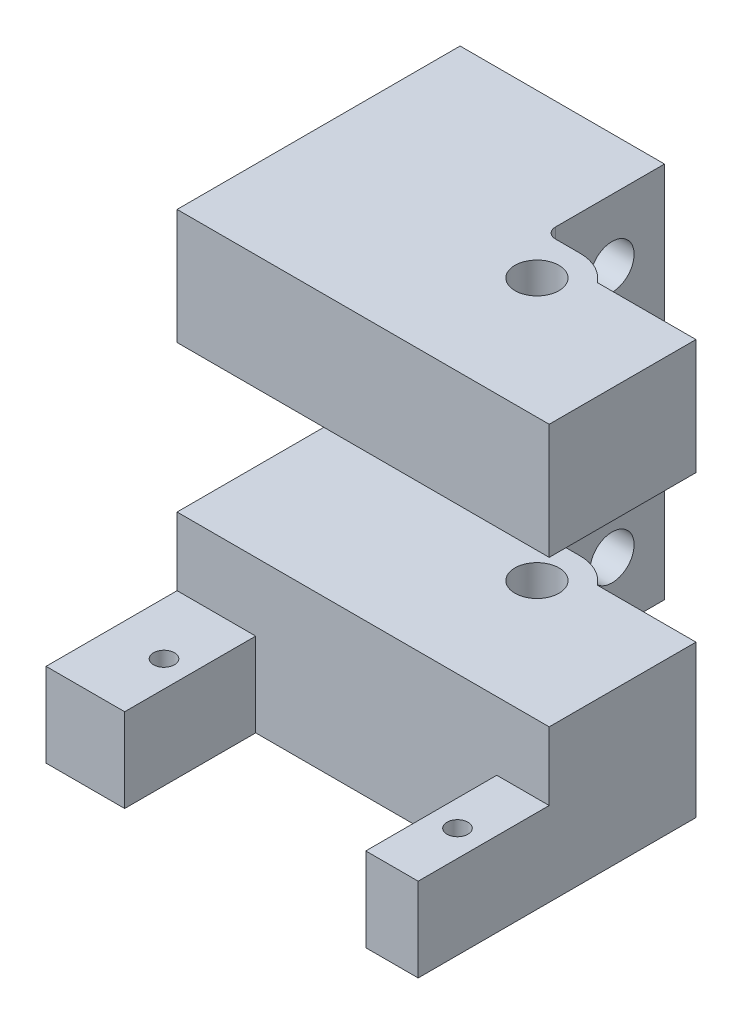
ISO-10303-21;
HEADER;
FILE_DESCRIPTION(('STEP AP214'),'2;1');
FILE_NAME('part.step','',(''),(''),'','','');
FILE_SCHEMA(('AUTOMOTIVE_DESIGN { 1 0 10303 214 1 1 1 1 }'));
ENDSEC;
DATA;
#1=APPLICATION_CONTEXT('core data for automotive mechanical design processes');
#2=APPLICATION_PROTOCOL_DEFINITION('international standard','automotive_design',2000,#1);
#3=PRODUCT_CONTEXT('',#1,'mechanical');
#4=PRODUCT('Part','Part','',(#3));
#5=PRODUCT_RELATED_PRODUCT_CATEGORY('part','',(#4));
#6=PRODUCT_DEFINITION_FORMATION('','',#4);
#7=PRODUCT_DEFINITION_CONTEXT('part definition',#1,'design');
#8=PRODUCT_DEFINITION('design','',#6,#7);
#9=PRODUCT_DEFINITION_SHAPE('','',#8);
#10=(LENGTH_UNIT() NAMED_UNIT(*) SI_UNIT(.MILLI.,.METRE.));
#11=(NAMED_UNIT(*) PLANE_ANGLE_UNIT() SI_UNIT($,.RADIAN.));
#12=(NAMED_UNIT(*) SI_UNIT($,.STERADIAN.) SOLID_ANGLE_UNIT());
#13=UNCERTAINTY_MEASURE_WITH_UNIT(LENGTH_MEASURE(1.E-05),#10,'distance_accuracy_value','');
#14=(GEOMETRIC_REPRESENTATION_CONTEXT(3) GLOBAL_UNCERTAINTY_ASSIGNED_CONTEXT((#13)) GLOBAL_UNIT_ASSIGNED_CONTEXT((#10,
#11,#12)) REPRESENTATION_CONTEXT('',''));
#15=CARTESIAN_POINT('',(0.,0.,0.));
#16=DIRECTION('',(0.,0.,1.));
#17=DIRECTION('',(1.,0.,0.));
#18=AXIS2_PLACEMENT_3D('',#15,#16,#17);
#19=CARTESIAN_POINT('',(-64.4473319220206,11.5,-25.25));
#20=DIRECTION('',(0.,0.,-1.));
#21=DIRECTION('',(0.,1.,0.));
#22=AXIS2_PLACEMENT_3D('',#19,#20,#21);
#23=PLANE('',#22);
#24=DIRECTION('',(-1.,0.,0.));
#25=VECTOR('',#24,1.);
#26=CARTESIAN_POINT('',(16.5,8.,-25.25));
#27=LINE('',#26,#25);
#28=CARTESIAN_POINT('',(16.5,8.,-25.25));
#29=VERTEX_POINT('',#28);
#30=CARTESIAN_POINT('',(7.08187991276449,8.,-25.25));
#31=VERTEX_POINT('',#30);
#32=EDGE_CURVE('E385',#29,#31,#27,.T.);
#33=ORIENTED_EDGE('',*,*,#32,.T.);
#34=DIRECTION('',(0.,-1.,0.));
#35=VECTOR('',#34,1.);
#36=CARTESIAN_POINT('',(7.08187991276449,36.2735620751605,-25.25));
#37=LINE('',#36,#35);
#38=CARTESIAN_POINT('',(7.08187991276449,22.5,-25.25));
#39=VERTEX_POINT('',#38);
#40=EDGE_CURVE('E278',#39,#31,#37,.T.);
#41=ORIENTED_EDGE('',*,*,#40,.F.);
#42=DIRECTION('',(1.,0.,0.));
#43=VECTOR('',#42,1.);
#44=CARTESIAN_POINT('',(0.500000000000009,22.5,-25.25));
#45=LINE('',#44,#43);
#46=CARTESIAN_POINT('',(16.5,22.5,-25.25));
#47=VERTEX_POINT('',#46);
#48=EDGE_CURVE('E375',#39,#47,#45,.T.);
#49=ORIENTED_EDGE('',*,*,#48,.T.);
#50=DIRECTION('',(0.,-1.,0.));
#51=VECTOR('',#50,1.);
#52=CARTESIAN_POINT('',(16.5,22.5,-25.25));
#53=LINE('',#52,#51);
#54=EDGE_CURVE('E389',#47,#29,#53,.T.);
#55=ORIENTED_EDGE('',*,*,#54,.T.);
#56=EDGE_LOOP('',(#33,#41,#49,#55));
#57=FACE_BOUND('',#56,.T.);
#58=ADVANCED_FACE('F52',(#57),#23,.T.);
#59=CARTESIAN_POINT('',(0.500000000000008,0.,0.));
#60=DIRECTION('',(1.,0.,0.));
#61=DIRECTION('',(0.,0.,-1.));
#62=AXIS2_PLACEMENT_3D('',#59,#60,#61);
#63=PLANE('',#62);
#64=CARTESIAN_POINT('',(0.500000000000001,41.5,-33.25));
#65=DIRECTION('',(1.,0.,0.));
#66=DIRECTION('',(0.,0.,-1.));
#67=AXIS2_PLACEMENT_3D('',#64,#65,#66);
#68=CIRCLE('',#67,2.1);
#69=CARTESIAN_POINT('',(0.5,41.5,-35.35));
#70=VERTEX_POINT('',#69);
#71=EDGE_CURVE('E617',#70,#70,#68,.T.);
#72=ORIENTED_EDGE('',*,*,#71,.F.);
#73=EDGE_LOOP('',(#72));
#74=FACE_BOUND('',#73,.T.);
#75=CARTESIAN_POINT('',(0.500000000000001,17.5,-33.25));
#76=DIRECTION('',(1.,0.,0.));
#77=DIRECTION('',(0.,0.,-1.));
#78=AXIS2_PLACEMENT_3D('',#75,#76,#77);
#79=CIRCLE('',#78,2.1);
#80=CARTESIAN_POINT('',(0.5,17.5,-35.35));
#81=VERTEX_POINT('',#80);
#82=EDGE_CURVE('E611',#81,#81,#79,.T.);
#83=ORIENTED_EDGE('',*,*,#82,.F.);
#84=EDGE_LOOP('',(#83));
#85=FACE_BOUND('',#84,.T.);
#86=CARTESIAN_POINT('',(0.500000000000001,29.5,-33.25));
#87=DIRECTION('',(1.,0.,0.));
#88=DIRECTION('',(0.,0.,-1.));
#89=AXIS2_PLACEMENT_3D('',#86,#87,#88);
#90=CIRCLE('',#89,2.1);
#91=CARTESIAN_POINT('',(0.5,29.5,-35.35));
#92=VERTEX_POINT('',#91);
#93=EDGE_CURVE('E605',#92,#92,#90,.T.);
#94=ORIENTED_EDGE('',*,*,#93,.F.);
#95=EDGE_LOOP('',(#94));
#96=FACE_BOUND('',#95,.T.);
#97=DIRECTION('',(0.,0.,-1.));
#98=VECTOR('',#97,1.);
#99=CARTESIAN_POINT('',(0.5,22.5,-29.25));
#100=LINE('',#99,#98);
#101=CARTESIAN_POINT('',(0.5,22.5,-27.85));
#102=VERTEX_POINT('',#101);
#103=CARTESIAN_POINT('',(0.500000000000002,22.5,-29.9828873076406));
#104=VERTEX_POINT('',#103);
#105=EDGE_CURVE('E294',#102,#104,#100,.T.);
#106=ORIENTED_EDGE('',*,*,#105,.F.);
#107=DIRECTION('',(0.,-1.,0.));
#108=VECTOR('',#107,1.);
#109=CARTESIAN_POINT('',(0.500000000000002,11.5,-27.85));
#110=LINE('',#109,#108);
#111=CARTESIAN_POINT('',(0.500000000000002,11.5,-27.85));
#112=VERTEX_POINT('',#111);
#113=EDGE_CURVE('E451',#102,#112,#110,.T.);
#114=ORIENTED_EDGE('',*,*,#113,.T.);
#115=DIRECTION('',(0.,0.,-1.));
#116=VECTOR('',#115,1.);
#117=CARTESIAN_POINT('',(0.500000000000002,11.5,-26.25));
#118=LINE('',#117,#116);
#119=CARTESIAN_POINT('',(0.5,11.5,-38.25));
#120=VERTEX_POINT('',#119);
#121=EDGE_CURVE('E422',#112,#120,#118,.T.);
#122=ORIENTED_EDGE('',*,*,#121,.T.);
#123=DIRECTION('',(0.,1.,0.));
#124=VECTOR('',#123,1.);
#125=CARTESIAN_POINT('',(0.5,11.5,-38.25));
#126=LINE('',#125,#124);
#127=CARTESIAN_POINT('',(0.5,47.5,-38.25));
#128=VERTEX_POINT('',#127);
#129=EDGE_CURVE('E425',#120,#128,#126,.T.);
#130=ORIENTED_EDGE('',*,*,#129,.T.);
#131=DIRECTION('',(0.,0.,1.));
#132=VECTOR('',#131,1.);
#133=CARTESIAN_POINT('',(0.5,47.5,-38.25));
#134=LINE('',#133,#132);
#135=CARTESIAN_POINT('',(0.500000000000002,47.5,-27.85));
#136=VERTEX_POINT('',#135);
#137=EDGE_CURVE('E428',#128,#136,#134,.T.);
#138=ORIENTED_EDGE('',*,*,#137,.T.);
#139=DIRECTION('',(0.,1.,0.));
#140=VECTOR('',#139,1.);
#141=CARTESIAN_POINT('',(0.500000000000002,0.,-27.85));
#142=LINE('',#141,#140);
#143=CARTESIAN_POINT('',(0.5,36.5,-27.85));
#144=VERTEX_POINT('',#143);
#145=EDGE_CURVE('E446',#136,#144,#142,.F.);
#146=ORIENTED_EDGE('',*,*,#145,.T.);
#147=DIRECTION('',(0.,0.,1.));
#148=VECTOR('',#147,1.);
#149=CARTESIAN_POINT('',(0.5,36.5,-29.25));
#150=LINE('',#149,#148);
#151=CARTESIAN_POINT('',(0.5,36.5,-29.9828873076406));
#152=VERTEX_POINT('',#151);
#153=EDGE_CURVE('E286',#152,#144,#150,.T.);
#154=ORIENTED_EDGE('',*,*,#153,.F.);
#155=DIRECTION('',(0.,-1.,0.));
#156=VECTOR('',#155,1.);
#157=CARTESIAN_POINT('',(0.500000000000002,0.,-29.9828873076406));
#158=LINE('',#157,#156);
#159=EDGE_CURVE('E448',#152,#104,#158,.T.);
#160=ORIENTED_EDGE('',*,*,#159,.T.);
#161=EDGE_LOOP('',(#106,#114,#122,#130,#138,#146,#154,#160));
#162=FACE_BOUND('',#161,.T.);
#163=ADVANCED_FACE('F479',(#74,#85,#96,#162),#63,.T.);
#164=CARTESIAN_POINT('',(-64.4473319220206,11.5,-25.25));
#165=DIRECTION('',(0.,0.,-1.));
#166=DIRECTION('',(0.,1.,0.));
#167=AXIS2_PLACEMENT_3D('',#164,#165,#166);
#168=PLANE('',#167);
#169=DIRECTION('',(-1.,0.,0.));
#170=VECTOR('',#169,1.);
#171=CARTESIAN_POINT('',(16.5,36.5,-25.25));
#172=LINE('',#171,#170);
#173=CARTESIAN_POINT('',(16.5,36.5,-25.25));
#174=VERTEX_POINT('',#173);
#175=CARTESIAN_POINT('',(7.08187991276449,36.5,-25.25));
#176=VERTEX_POINT('',#175);
#177=EDGE_CURVE('E373',#174,#176,#172,.T.);
#178=ORIENTED_EDGE('',*,*,#177,.T.);
#179=DIRECTION('',(0.,1.,0.));
#180=VECTOR('',#179,1.);
#181=CARTESIAN_POINT('',(7.08187991276449,22.7264379248395,-25.25));
#182=LINE('',#181,#180);
#183=CARTESIAN_POINT('',(7.08187991276449,47.5,-25.25));
#184=VERTEX_POINT('',#183);
#185=EDGE_CURVE('E248',#176,#184,#182,.T.);
#186=ORIENTED_EDGE('',*,*,#185,.T.);
#187=DIRECTION('',(1.,0.,0.));
#188=VECTOR('',#187,1.);
#189=CARTESIAN_POINT('',(0.500000000000013,47.5,-25.25));
#190=LINE('',#189,#188);
#191=CARTESIAN_POINT('',(16.5,47.5,-25.25));
#192=VERTEX_POINT('',#191);
#193=EDGE_CURVE('E262',#184,#192,#190,.T.);
#194=ORIENTED_EDGE('',*,*,#193,.T.);
#195=DIRECTION('',(0.,-1.,0.));
#196=VECTOR('',#195,1.);
#197=CARTESIAN_POINT('',(16.5,47.5,-25.25));
#198=LINE('',#197,#196);
#199=EDGE_CURVE('E376',#192,#174,#198,.T.);
#200=ORIENTED_EDGE('',*,*,#199,.T.);
#201=EDGE_LOOP('',(#178,#186,#194,#200));
#202=FACE_BOUND('',#201,.T.);
#203=ADVANCED_FACE('F505',(#202),#168,.T.);
#204=CARTESIAN_POINT('',(-19.,16.,6.25));
#205=DIRECTION('',(-1.,0.,0.));
#206=DIRECTION('',(0.,0.,1.));
#207=AXIS2_PLACEMENT_3D('',#204,#205,#206);
#208=PLANE('',#207);
#209=DIRECTION('',(0.,0.,1.));
#210=VECTOR('',#209,1.);
#211=CARTESIAN_POINT('',(-19.,22.5,-6.25));
#212=LINE('',#211,#210);
#213=CARTESIAN_POINT('',(-19.,22.5,-26.25));
#214=VERTEX_POINT('',#213);
#215=CARTESIAN_POINT('',(-19.,22.5,-11.25));
#216=VERTEX_POINT('',#215);
#217=EDGE_CURVE('E406',#214,#216,#212,.T.);
#218=ORIENTED_EDGE('',*,*,#217,.F.);
#219=DIRECTION('',(0.,-1.,0.));
#220=VECTOR('',#219,1.);
#221=CARTESIAN_POINT('',(-19.,57.577238908358,-26.25));
#222=LINE('',#221,#220);
#223=CARTESIAN_POINT('',(-19.,36.5,-26.25));
#224=VERTEX_POINT('',#223);
#225=EDGE_CURVE('E296',#224,#214,#222,.T.);
#226=ORIENTED_EDGE('',*,*,#225,.F.);
#227=DIRECTION('',(0.,0.,-1.));
#228=VECTOR('',#227,1.);
#229=CARTESIAN_POINT('',(-19.,36.5,-21.25));
#230=LINE('',#229,#228);
#231=CARTESIAN_POINT('',(-19.,36.5,-11.25));
#232=VERTEX_POINT('',#231);
#233=EDGE_CURVE('E409',#232,#224,#230,.T.);
#234=ORIENTED_EDGE('',*,*,#233,.F.);
#235=DIRECTION('',(0.,-1.,0.));
#236=VECTOR('',#235,1.);
#237=CARTESIAN_POINT('',(-19.,47.5,-11.25));
#238=LINE('',#237,#236);
#239=CARTESIAN_POINT('',(-19.,47.5,-11.25));
#240=VERTEX_POINT('',#239);
#241=EDGE_CURVE('E357',#240,#232,#238,.T.);
#242=ORIENTED_EDGE('',*,*,#241,.F.);
#243=DIRECTION('',(0.,0.,1.));
#244=VECTOR('',#243,1.);
#245=CARTESIAN_POINT('',(-19.,47.5,6.25));
#246=LINE('',#245,#244);
#247=CARTESIAN_POINT('',(-19.,47.5,-38.25));
#248=VERTEX_POINT('',#247);
#249=EDGE_CURVE('E411',#248,#240,#246,.T.);
#250=ORIENTED_EDGE('',*,*,#249,.F.);
#251=DIRECTION('',(0.,1.,0.));
#252=VECTOR('',#251,1.);
#253=CARTESIAN_POINT('',(-19.,47.5,-38.25));
#254=LINE('',#253,#252);
#255=CARTESIAN_POINT('',(-19.,11.5,-38.25));
#256=VERTEX_POINT('',#255);
#257=EDGE_CURVE('E414',#256,#248,#254,.T.);
#258=ORIENTED_EDGE('',*,*,#257,.F.);
#259=DIRECTION('',(0.,0.,-1.));
#260=VECTOR('',#259,1.);
#261=CARTESIAN_POINT('',(-19.,11.5,-38.25));
#262=LINE('',#261,#260);
#263=CARTESIAN_POINT('',(-19.,11.5,-25.25));
#264=VERTEX_POINT('',#263);
#265=EDGE_CURVE('E417',#264,#256,#262,.T.);
#266=ORIENTED_EDGE('',*,*,#265,.F.);
#267=DIRECTION('',(0.,1.,0.));
#268=VECTOR('',#267,1.);
#269=CARTESIAN_POINT('',(-19.,7.99999999999998,-25.25));
#270=LINE('',#269,#268);
#271=CARTESIAN_POINT('',(-19.,8.,-25.25));
#272=VERTEX_POINT('',#271);
#273=EDGE_CURVE('E383',#272,#264,#270,.T.);
#274=ORIENTED_EDGE('',*,*,#273,.F.);
#275=DIRECTION('',(0.,0.,-1.));
#276=VECTOR('',#275,1.);
#277=CARTESIAN_POINT('',(-19.,8.,6.25));
#278=LINE('',#277,#276);
#279=CARTESIAN_POINT('',(-19.,8.,1.25));
#280=VERTEX_POINT('',#279);
#281=EDGE_CURVE('E382',#280,#272,#278,.T.);
#282=ORIENTED_EDGE('',*,*,#281,.F.);
#283=DIRECTION('',(0.,-1.,0.));
#284=VECTOR('',#283,1.);
#285=CARTESIAN_POINT('',(-19.,16.,1.25));
#286=LINE('',#285,#284);
#287=CARTESIAN_POINT('',(-19.,16.,1.25));
#288=VERTEX_POINT('',#287);
#289=EDGE_CURVE('E307',#288,#280,#286,.T.);
#290=ORIENTED_EDGE('',*,*,#289,.F.);
#291=DIRECTION('',(0.,0.,1.));
#292=VECTOR('',#291,1.);
#293=CARTESIAN_POINT('',(-19.,16.,6.25));
#294=LINE('',#293,#292);
#295=CARTESIAN_POINT('',(-19.,16.,-11.25));
#296=VERTEX_POINT('',#295);
#297=EDGE_CURVE('E403',#296,#288,#294,.T.);
#298=ORIENTED_EDGE('',*,*,#297,.F.);
#299=DIRECTION('',(0.,-1.,0.));
#300=VECTOR('',#299,1.);
#301=CARTESIAN_POINT('',(-19.,22.5,-11.25));
#302=LINE('',#301,#300);
#303=EDGE_CURVE('E349',#216,#296,#302,.T.);
#304=ORIENTED_EDGE('',*,*,#303,.F.);
#305=EDGE_LOOP('',(#218,#226,#234,#242,#250,#258,#266,#274,#282,#290,#298,#304));
#306=FACE_BOUND('',#305,.T.);
#307=ADVANCED_FACE('F490',(#306),#208,.T.);
#308=CARTESIAN_POINT('',(-11.5,16.,6.25));
#309=DIRECTION('',(-1.,0.,0.));
#310=DIRECTION('',(0.,0.,1.));
#311=AXIS2_PLACEMENT_3D('',#308,#309,#310);
#312=PLANE('',#311);
#313=DIRECTION('',(0.,1.,0.));
#314=VECTOR('',#313,1.);
#315=CARTESIAN_POINT('',(-11.5,8.,1.25));
#316=LINE('',#315,#314);
#317=CARTESIAN_POINT('',(-11.5,8.,1.25));
#318=VERTEX_POINT('',#317);
#319=CARTESIAN_POINT('',(-11.5,16.,1.25));
#320=VERTEX_POINT('',#319);
#321=EDGE_CURVE('E329',#318,#320,#316,.T.);
#322=ORIENTED_EDGE('',*,*,#321,.F.);
#323=DIRECTION('',(0.,0.,1.));
#324=VECTOR('',#323,1.);
#325=CARTESIAN_POINT('',(-11.5,8.,-6.25));
#326=LINE('',#325,#324);
#327=CARTESIAN_POINT('',(-11.5,8.,-11.25));
#328=VERTEX_POINT('',#327);
#329=EDGE_CURVE('E400',#328,#318,#326,.T.);
#330=ORIENTED_EDGE('',*,*,#329,.F.);
#331=DIRECTION('',(0.,-1.,0.));
#332=VECTOR('',#331,1.);
#333=CARTESIAN_POINT('',(-11.5,16.,-11.25));
#334=LINE('',#333,#332);
#335=CARTESIAN_POINT('',(-11.5,16.,-11.25));
#336=VERTEX_POINT('',#335);
#337=EDGE_CURVE('E332',#336,#328,#334,.T.);
#338=ORIENTED_EDGE('',*,*,#337,.F.);
#339=DIRECTION('',(0.,0.,-1.));
#340=VECTOR('',#339,1.);
#341=CARTESIAN_POINT('',(-11.5,16.,6.25));
#342=LINE('',#341,#340);
#343=EDGE_CURVE('E439',#320,#336,#342,.T.);
#344=ORIENTED_EDGE('',*,*,#343,.F.);
#345=EDGE_LOOP('',(#322,#330,#338,#344));
#346=FACE_BOUND('',#345,.T.);
#347=ADVANCED_FACE('F512',(#346),#312,.F.);
#348=CARTESIAN_POINT('',(11.5,16.,6.25));
#349=DIRECTION('',(1.,0.,0.));
#350=DIRECTION('',(0.,0.,-1.));
#351=AXIS2_PLACEMENT_3D('',#348,#349,#350);
#352=PLANE('',#351);
#353=DIRECTION('',(0.,-1.,0.));
#354=VECTOR('',#353,1.);
#355=CARTESIAN_POINT('',(11.5,16.,1.25));
#356=LINE('',#355,#354);
#357=CARTESIAN_POINT('',(11.5,16.,1.25));
#358=VERTEX_POINT('',#357);
#359=CARTESIAN_POINT('',(11.5,8.,1.25));
#360=VERTEX_POINT('',#359);
#361=EDGE_CURVE('E316',#358,#360,#356,.T.);
#362=ORIENTED_EDGE('',*,*,#361,.F.);
#363=DIRECTION('',(0.,0.,1.));
#364=VECTOR('',#363,1.);
#365=CARTESIAN_POINT('',(11.5,16.,6.25));
#366=LINE('',#365,#364);
#367=CARTESIAN_POINT('',(11.5,16.,-11.25));
#368=VERTEX_POINT('',#367);
#369=EDGE_CURVE('E441',#368,#358,#366,.T.);
#370=ORIENTED_EDGE('',*,*,#369,.F.);
#371=DIRECTION('',(0.,1.,0.));
#372=VECTOR('',#371,1.);
#373=CARTESIAN_POINT('',(11.5,8.,-11.25));
#374=LINE('',#373,#372);
#375=CARTESIAN_POINT('',(11.5,8.,-11.25));
#376=VERTEX_POINT('',#375);
#377=EDGE_CURVE('E339',#376,#368,#374,.T.);
#378=ORIENTED_EDGE('',*,*,#377,.F.);
#379=DIRECTION('',(0.,0.,-1.));
#380=VECTOR('',#379,1.);
#381=CARTESIAN_POINT('',(11.5,8.,6.25));
#382=LINE('',#381,#380);
#383=EDGE_CURVE('E398',#360,#376,#382,.T.);
#384=ORIENTED_EDGE('',*,*,#383,.F.);
#385=EDGE_LOOP('',(#362,#370,#378,#384));
#386=FACE_BOUND('',#385,.T.);
#387=ADVANCED_FACE('F555',(#386),#352,.F.);
#388=CARTESIAN_POINT('',(16.5,16.,-21.25));
#389=DIRECTION('',(-1.,0.,0.));
#390=DIRECTION('',(0.,0.,1.));
#391=AXIS2_PLACEMENT_3D('',#388,#389,#390);
#392=PLANE('',#391);
#393=DIRECTION('',(0.,1.,0.));
#394=VECTOR('',#393,1.);
#395=CARTESIAN_POINT('',(16.5,8.,1.25));
#396=LINE('',#395,#394);
#397=CARTESIAN_POINT('',(16.5,8.,1.25));
#398=VERTEX_POINT('',#397);
#399=CARTESIAN_POINT('',(16.5,16.,1.25));
#400=VERTEX_POINT('',#399);
#401=EDGE_CURVE('E321',#398,#400,#396,.T.);
#402=ORIENTED_EDGE('',*,*,#401,.F.);
#403=DIRECTION('',(0.,0.,1.));
#404=VECTOR('',#403,1.);
#405=CARTESIAN_POINT('',(16.5,8.,-21.25));
#406=LINE('',#405,#404);
#407=EDGE_CURVE('E395',#29,#398,#406,.T.);
#408=ORIENTED_EDGE('',*,*,#407,.F.);
#409=ORIENTED_EDGE('',*,*,#54,.F.);
#410=DIRECTION('',(0.,0.,-1.));
#411=VECTOR('',#410,1.);
#412=CARTESIAN_POINT('',(16.5,22.5,-6.25));
#413=LINE('',#412,#411);
#414=CARTESIAN_POINT('',(16.5,22.5,-11.25));
#415=VERTEX_POINT('',#414);
#416=EDGE_CURVE('E434',#415,#47,#413,.T.);
#417=ORIENTED_EDGE('',*,*,#416,.F.);
#418=DIRECTION('',(0.,1.,0.));
#419=VECTOR('',#418,1.);
#420=CARTESIAN_POINT('',(16.5,16.,-11.25));
#421=LINE('',#420,#419);
#422=CARTESIAN_POINT('',(16.5,16.,-11.25));
#423=VERTEX_POINT('',#422);
#424=EDGE_CURVE('E345',#423,#415,#421,.T.);
#425=ORIENTED_EDGE('',*,*,#424,.F.);
#426=DIRECTION('',(0.,0.,-1.));
#427=VECTOR('',#426,1.);
#428=CARTESIAN_POINT('',(16.5,16.,-21.25));
#429=LINE('',#428,#427);
#430=EDGE_CURVE('E444',#400,#423,#429,.T.);
#431=ORIENTED_EDGE('',*,*,#430,.F.);
#432=EDGE_LOOP('',(#402,#408,#409,#417,#425,#431));
#433=FACE_BOUND('',#432,.T.);
#434=ADVANCED_FACE('F551',(#433),#392,.F.);
#435=CARTESIAN_POINT('',(0.,16.,0.));
#436=DIRECTION('',(0.,1.,0.));
#437=DIRECTION('',(0.,0.,1.));
#438=AXIS2_PLACEMENT_3D('',#435,#436,#437);
#439=PLANE('',#438);
#440=CARTESIAN_POINT('',(-14.,16.,-5.));
#441=DIRECTION('',(0.,1.,0.));
#442=DIRECTION('',(0.,0.,-1.));
#443=AXIS2_PLACEMENT_3D('',#440,#441,#442);
#444=CIRCLE('',#443,1.);
#445=CARTESIAN_POINT('',(-14.,16.,-6.));
#446=VERTEX_POINT('',#445);
#447=EDGE_CURVE('E289',#446,#446,#444,.T.);
#448=ORIENTED_EDGE('',*,*,#447,.F.);
#449=EDGE_LOOP('',(#448));
#450=FACE_BOUND('',#449,.T.);
#451=ORIENTED_EDGE('',*,*,#297,.T.);
#452=DIRECTION('',(-1.,0.,0.));
#453=VECTOR('',#452,1.);
#454=CARTESIAN_POINT('',(-11.5,16.,1.25));
#455=LINE('',#454,#453);
#456=EDGE_CURVE('E319',#320,#288,#455,.T.);
#457=ORIENTED_EDGE('',*,*,#456,.F.);
#458=ORIENTED_EDGE('',*,*,#343,.T.);
#459=DIRECTION('',(1.,0.,0.));
#460=VECTOR('',#459,1.);
#461=CARTESIAN_POINT('',(-19.,16.,-11.25));
#462=LINE('',#461,#460);
#463=EDGE_CURVE('E352',#296,#336,#462,.T.);
#464=ORIENTED_EDGE('',*,*,#463,.F.);
#465=EDGE_LOOP('',(#451,#457,#458,#464));
#466=FACE_BOUND('',#465,.T.);
#467=ADVANCED_FACE('F547',(#450,#466),#439,.T.);
#468=CARTESIAN_POINT('',(14.,16.,-5.));
#469=DIRECTION('',(0.,1.,0.));
#470=DIRECTION('',(0.,0.,1.));
#471=AXIS2_PLACEMENT_3D('',#468,#469,#470);
#472=CIRCLE('',#471,1.);
#473=CARTESIAN_POINT('',(14.,16.,-4.));
#474=VERTEX_POINT('',#473);
#475=EDGE_CURVE('E308',#474,#474,#472,.T.);
#476=ORIENTED_EDGE('',*,*,#475,.F.);
#477=EDGE_LOOP('',(#476));
#478=FACE_BOUND('',#477,.T.);
#479=ORIENTED_EDGE('',*,*,#369,.T.);
#480=DIRECTION('',(-1.,0.,0.));
#481=VECTOR('',#480,1.);
#482=CARTESIAN_POINT('',(16.5,16.,1.25));
#483=LINE('',#482,#481);
#484=EDGE_CURVE('E323',#400,#358,#483,.T.);
#485=ORIENTED_EDGE('',*,*,#484,.F.);
#486=ORIENTED_EDGE('',*,*,#430,.T.);
#487=DIRECTION('',(1.,0.,0.));
#488=VECTOR('',#487,1.);
#489=CARTESIAN_POINT('',(11.5,16.,-11.25));
#490=LINE('',#489,#488);
#491=EDGE_CURVE('E342',#368,#423,#490,.T.);
#492=ORIENTED_EDGE('',*,*,#491,.F.);
#493=EDGE_LOOP('',(#479,#485,#486,#492));
#494=FACE_BOUND('',#493,.T.);
#495=ADVANCED_FACE('F550',(#478,#494),#439,.T.);
#496=CARTESIAN_POINT('',(0.,8.,0.));
#497=DIRECTION('',(0.,-1.,0.));
#498=DIRECTION('',(0.,0.,-1.));
#499=AXIS2_PLACEMENT_3D('',#496,#497,#498);
#500=PLANE('',#499);
#501=CARTESIAN_POINT('',(0.582649189055734,8.,-25.25));
#502=VERTEX_POINT('',#501);
#503=EDGE_CURVE('E388',#502,#272,#27,.T.);
#504=ORIENTED_EDGE('',*,*,#503,.F.);
#505=CARTESIAN_POINT('',(3.83226455091011,8.,-22.75));
#506=DIRECTION('',(0.,-1.,0.));
#507=DIRECTION('',(0.,0.,-1.));
#508=AXIS2_PLACEMENT_3D('',#505,#506,#507);
#509=CIRCLE('',#508,4.1);
#510=EDGE_CURVE('E598',#502,#31,#509,.T.);
#511=ORIENTED_EDGE('',*,*,#510,.T.);
#512=ORIENTED_EDGE('',*,*,#32,.F.);
#513=ORIENTED_EDGE('',*,*,#407,.T.);
#514=DIRECTION('',(1.,0.,0.));
#515=VECTOR('',#514,1.);
#516=CARTESIAN_POINT('',(11.5,8.,1.25));
#517=LINE('',#516,#515);
#518=EDGE_CURVE('E318',#360,#398,#517,.T.);
#519=ORIENTED_EDGE('',*,*,#518,.F.);
#520=ORIENTED_EDGE('',*,*,#383,.T.);
#521=DIRECTION('',(1.,0.,0.));
#522=VECTOR('',#521,1.);
#523=CARTESIAN_POINT('',(-11.5,8.,-11.25));
#524=LINE('',#523,#522);
#525=EDGE_CURVE('E335',#328,#376,#524,.T.);
#526=ORIENTED_EDGE('',*,*,#525,.F.);
#527=ORIENTED_EDGE('',*,*,#329,.T.);
#528=DIRECTION('',(1.,0.,0.));
#529=VECTOR('',#528,1.);
#530=CARTESIAN_POINT('',(-19.,8.,1.25));
#531=LINE('',#530,#529);
#532=EDGE_CURVE('E327',#280,#318,#531,.T.);
#533=ORIENTED_EDGE('',*,*,#532,.F.);
#534=ORIENTED_EDGE('',*,*,#281,.T.);
#535=EDGE_LOOP('',(#504,#511,#512,#513,#519,#520,#526,#527,#533,#534));
#536=FACE_BOUND('',#535,.T.);
#537=CARTESIAN_POINT('',(14.,8.,-5.));
#538=DIRECTION('',(0.,1.,0.));
#539=DIRECTION('',(0.,0.,1.));
#540=AXIS2_PLACEMENT_3D('',#537,#538,#539);
#541=CIRCLE('',#540,1.);
#542=CARTESIAN_POINT('',(14.,8.,-4.));
#543=VERTEX_POINT('',#542);
#544=EDGE_CURVE('E304',#543,#543,#541,.T.);
#545=ORIENTED_EDGE('',*,*,#544,.T.);
#546=EDGE_LOOP('',(#545));
#547=FACE_BOUND('',#546,.T.);
#548=CARTESIAN_POINT('',(-14.,8.,-5.));
#549=DIRECTION('',(0.,1.,0.));
#550=DIRECTION('',(0.,0.,-1.));
#551=AXIS2_PLACEMENT_3D('',#548,#549,#550);
#552=CIRCLE('',#551,1.);
#553=CARTESIAN_POINT('',(-14.,8.,-6.));
#554=VERTEX_POINT('',#553);
#555=EDGE_CURVE('E311',#554,#554,#552,.T.);
#556=ORIENTED_EDGE('',*,*,#555,.T.);
#557=EDGE_LOOP('',(#556));
#558=FACE_BOUND('',#557,.T.);
#559=CARTESIAN_POINT('',(3.83226455091011,8.,-22.75));
#560=DIRECTION('',(0.,-1.,0.));
#561=DIRECTION('',(0.,0.,-1.));
#562=AXIS2_PLACEMENT_3D('',#559,#560,#561);
#563=CIRCLE('',#562,2.1);
#564=CARTESIAN_POINT('',(3.83226455091011,8.,-24.85));
#565=VERTEX_POINT('',#564);
#566=EDGE_CURVE('E355',#565,#565,#563,.T.);
#567=ORIENTED_EDGE('',*,*,#566,.F.);
#568=EDGE_LOOP('',(#567));
#569=FACE_BOUND('',#568,.T.);
#570=ADVANCED_FACE('F545',(#536,#547,#558,#569),#500,.T.);
#571=CARTESIAN_POINT('',(0.,22.5,0.));
#572=DIRECTION('',(0.,1.,0.));
#573=DIRECTION('',(0.,0.,1.));
#574=AXIS2_PLACEMENT_3D('',#571,#572,#573);
#575=PLANE('',#574);
#576=DIRECTION('',(-1.,0.,0.));
#577=VECTOR('',#576,1.);
#578=CARTESIAN_POINT('',(3.83226455091011,22.5,-26.85));
#579=LINE('',#578,#577);
#580=CARTESIAN_POINT('',(3.83226455091011,22.5,-26.85));
#581=VERTEX_POINT('',#580);
#582=CARTESIAN_POINT('',(1.5,22.5,-26.85));
#583=VERTEX_POINT('',#582);
#584=EDGE_CURVE('E270',#581,#583,#579,.T.);
#585=ORIENTED_EDGE('',*,*,#584,.T.);
#586=CARTESIAN_POINT('',(1.5,22.5,-27.85));
#587=DIRECTION('',(0.,1.,0.));
#588=DIRECTION('',(0.,0.,1.));
#589=AXIS2_PLACEMENT_3D('',#586,#587,#588);
#590=CIRCLE('',#589,1.);
#591=EDGE_CURVE('E461',#583,#102,#590,.F.);
#592=ORIENTED_EDGE('',*,*,#591,.T.);
#593=ORIENTED_EDGE('',*,*,#105,.T.);
#594=CARTESIAN_POINT('',(-0.499999999999998,22.5,-29.9828873076406));
#595=DIRECTION('',(0.,1.,0.));
#596=DIRECTION('',(0.,0.,1.));
#597=AXIS2_PLACEMENT_3D('',#594,#595,#596);
#598=CIRCLE('',#597,1.);
#599=CARTESIAN_POINT('',(-0.198868632062903,22.5,-29.0293046425064));
#600=VERTEX_POINT('',#599);
#601=EDGE_CURVE('E463',#104,#600,#598,.F.);
#602=ORIENTED_EDGE('',*,*,#601,.T.);
#603=DIRECTION('',(-0.953582665134142,0.,0.301131367937097));
#604=VECTOR('',#603,1.);
#605=CARTESIAN_POINT('',(0.5,22.5,-29.25));
#606=LINE('',#605,#604);
#607=CARTESIAN_POINT('',(-8.99999999999999,22.5,-26.25));
#608=VERTEX_POINT('',#607);
#609=EDGE_CURVE('E276',#600,#608,#606,.T.);
#610=ORIENTED_EDGE('',*,*,#609,.T.);
#611=DIRECTION('',(-1.,0.,0.));
#612=VECTOR('',#611,1.);
#613=CARTESIAN_POINT('',(-8.99999999999999,22.5,-26.25));
#614=LINE('',#613,#612);
#615=EDGE_CURVE('E291',#608,#214,#614,.T.);
#616=ORIENTED_EDGE('',*,*,#615,.T.);
#617=ORIENTED_EDGE('',*,*,#217,.T.);
#618=DIRECTION('',(-1.,0.,0.));
#619=VECTOR('',#618,1.);
#620=CARTESIAN_POINT('',(16.5,22.5,-11.25));
#621=LINE('',#620,#619);
#622=EDGE_CURVE('E347',#415,#216,#621,.T.);
#623=ORIENTED_EDGE('',*,*,#622,.F.);
#624=ORIENTED_EDGE('',*,*,#416,.T.);
#625=ORIENTED_EDGE('',*,*,#48,.F.);
#626=CARTESIAN_POINT('',(3.83226455091011,22.5,-22.75));
#627=DIRECTION('',(0.,-1.,0.));
#628=DIRECTION('',(0.,0.,-1.));
#629=AXIS2_PLACEMENT_3D('',#626,#627,#628);
#630=CIRCLE('',#629,4.1);
#631=EDGE_CURVE('E273',#39,#581,#630,.F.);
#632=ORIENTED_EDGE('',*,*,#631,.T.);
#633=EDGE_LOOP('',(#585,#592,#593,#602,#610,#616,#617,#623,#624,#625,#632));
#634=FACE_BOUND('',#633,.T.);
#635=CARTESIAN_POINT('',(3.83226455091011,22.5,-22.75));
#636=DIRECTION('',(0.,1.,0.));
#637=DIRECTION('',(0.,0.,1.));
#638=AXIS2_PLACEMENT_3D('',#635,#636,#637);
#639=CIRCLE('',#638,2.09999999999999);
#640=CARTESIAN_POINT('',(3.83226455091011,22.5,-20.65));
#641=VERTEX_POINT('',#640);
#642=EDGE_CURVE('E367',#641,#641,#639,.T.);
#643=ORIENTED_EDGE('',*,*,#642,.F.);
#644=EDGE_LOOP('',(#643));
#645=FACE_BOUND('',#644,.T.);
#646=ADVANCED_FACE('F542',(#634,#645),#575,.T.);
#647=CARTESIAN_POINT('',(0.,47.5,0.));
#648=DIRECTION('',(0.,1.,0.));
#649=DIRECTION('',(0.,0.,1.));
#650=AXIS2_PLACEMENT_3D('',#647,#648,#649);
#651=PLANE('',#650);
#652=DIRECTION('',(1.,0.,0.));
#653=VECTOR('',#652,1.);
#654=CARTESIAN_POINT('',(3.83226455091011,47.5,-26.85));
#655=LINE('',#654,#653);
#656=CARTESIAN_POINT('',(1.5,47.5,-26.85));
#657=VERTEX_POINT('',#656);
#658=CARTESIAN_POINT('',(3.83226455091011,47.5,-26.85));
#659=VERTEX_POINT('',#658);
#660=EDGE_CURVE('E237',#657,#659,#655,.T.);
#661=ORIENTED_EDGE('',*,*,#660,.F.);
#662=CARTESIAN_POINT('',(1.5,47.5,-27.85));
#663=DIRECTION('',(0.,1.,0.));
#664=DIRECTION('',(0.,0.,1.));
#665=AXIS2_PLACEMENT_3D('',#662,#663,#664);
#666=CIRCLE('',#665,1.);
#667=EDGE_CURVE('E468',#657,#136,#666,.F.);
#668=ORIENTED_EDGE('',*,*,#667,.T.);
#669=ORIENTED_EDGE('',*,*,#137,.F.);
#670=DIRECTION('',(1.,0.,0.));
#671=VECTOR('',#670,1.);
#672=CARTESIAN_POINT('',(-64.4473319220206,47.5,-38.25));
#673=LINE('',#672,#671);
#674=EDGE_CURVE('E432',#248,#128,#673,.T.);
#675=ORIENTED_EDGE('',*,*,#674,.F.);
#676=ORIENTED_EDGE('',*,*,#249,.T.);
#677=DIRECTION('',(-1.,0.,0.));
#678=VECTOR('',#677,1.);
#679=CARTESIAN_POINT('',(16.5,47.5,-11.25));
#680=LINE('',#679,#678);
#681=CARTESIAN_POINT('',(16.5,47.5,-11.25));
#682=VERTEX_POINT('',#681);
#683=EDGE_CURVE('E325',#682,#240,#680,.T.);
#684=ORIENTED_EDGE('',*,*,#683,.F.);
#685=DIRECTION('',(0.,0.,-1.));
#686=VECTOR('',#685,1.);
#687=CARTESIAN_POINT('',(16.5,47.5,-21.25));
#688=LINE('',#687,#686);
#689=EDGE_CURVE('E420',#682,#192,#688,.T.);
#690=ORIENTED_EDGE('',*,*,#689,.T.);
#691=ORIENTED_EDGE('',*,*,#193,.F.);
#692=CARTESIAN_POINT('',(3.83226455091011,47.5,-22.75));
#693=DIRECTION('',(0.,-1.,0.));
#694=DIRECTION('',(0.,0.,-1.));
#695=AXIS2_PLACEMENT_3D('',#692,#693,#694);
#696=CIRCLE('',#695,4.1);
#697=EDGE_CURVE('E254',#659,#184,#696,.T.);
#698=ORIENTED_EDGE('',*,*,#697,.F.);
#699=EDGE_LOOP('',(#661,#668,#669,#675,#676,#684,#690,#691,#698));
#700=FACE_BOUND('',#699,.T.);
#701=CARTESIAN_POINT('',(3.83226455091011,47.5,-22.75));
#702=DIRECTION('',(0.,-1.,0.));
#703=DIRECTION('',(0.,0.,-1.));
#704=AXIS2_PLACEMENT_3D('',#701,#702,#703);
#705=CIRCLE('',#704,2.09999999999999);
#706=CARTESIAN_POINT('',(3.83226455091011,47.5,-24.85));
#707=VERTEX_POINT('',#706);
#708=EDGE_CURVE('E364',#707,#707,#705,.T.);
#709=ORIENTED_EDGE('',*,*,#708,.T.);
#710=EDGE_LOOP('',(#709));
#711=FACE_BOUND('',#710,.T.);
#712=ADVANCED_FACE('F259',(#700,#711),#651,.T.);
#713=CARTESIAN_POINT('',(0.,36.5,0.));
#714=DIRECTION('',(0.,-1.,0.));
#715=DIRECTION('',(0.,0.,-1.));
#716=AXIS2_PLACEMENT_3D('',#713,#714,#715);
#717=PLANE('',#716);
#718=ORIENTED_EDGE('',*,*,#153,.T.);
#719=CARTESIAN_POINT('',(1.5,36.5,-27.85));
#720=DIRECTION('',(0.,-1.,0.));
#721=DIRECTION('',(0.,0.,-1.));
#722=AXIS2_PLACEMENT_3D('',#719,#720,#721);
#723=CIRCLE('',#722,1.);
#724=CARTESIAN_POINT('',(1.5,36.5,-26.85));
#725=VERTEX_POINT('',#724);
#726=EDGE_CURVE('E60',#144,#725,#723,.F.);
#727=ORIENTED_EDGE('',*,*,#726,.T.);
#728=DIRECTION('',(1.,0.,0.));
#729=VECTOR('',#728,1.);
#730=CARTESIAN_POINT('',(3.83226455091011,36.5,-26.85));
#731=LINE('',#730,#729);
#732=CARTESIAN_POINT('',(3.83226455091011,36.5,-26.85));
#733=VERTEX_POINT('',#732);
#734=EDGE_CURVE('E247',#725,#733,#731,.T.);
#735=ORIENTED_EDGE('',*,*,#734,.T.);
#736=CARTESIAN_POINT('',(3.83226455091011,36.5,-22.75));
#737=DIRECTION('',(0.,-1.,0.));
#738=DIRECTION('',(0.,0.,-1.));
#739=AXIS2_PLACEMENT_3D('',#736,#737,#738);
#740=CIRCLE('',#739,4.1);
#741=EDGE_CURVE('E256',#733,#176,#740,.T.);
#742=ORIENTED_EDGE('',*,*,#741,.T.);
#743=ORIENTED_EDGE('',*,*,#177,.F.);
#744=DIRECTION('',(0.,0.,-1.));
#745=VECTOR('',#744,1.);
#746=CARTESIAN_POINT('',(16.5,36.5,-21.25));
#747=LINE('',#746,#745);
#748=CARTESIAN_POINT('',(16.5,36.5,-11.25));
#749=VERTEX_POINT('',#748);
#750=EDGE_CURVE('E419',#749,#174,#747,.T.);
#751=ORIENTED_EDGE('',*,*,#750,.F.);
#752=DIRECTION('',(1.,0.,0.));
#753=VECTOR('',#752,1.);
#754=CARTESIAN_POINT('',(-19.,36.5,-11.25));
#755=LINE('',#754,#753);
#756=EDGE_CURVE('E359',#232,#749,#755,.T.);
#757=ORIENTED_EDGE('',*,*,#756,.F.);
#758=ORIENTED_EDGE('',*,*,#233,.T.);
#759=DIRECTION('',(1.,0.,0.));
#760=VECTOR('',#759,1.);
#761=CARTESIAN_POINT('',(-8.99999999999999,36.5,-26.25));
#762=LINE('',#761,#760);
#763=CARTESIAN_POINT('',(-8.99999999999999,36.5,-26.25));
#764=VERTEX_POINT('',#763);
#765=EDGE_CURVE('E282',#224,#764,#762,.T.);
#766=ORIENTED_EDGE('',*,*,#765,.T.);
#767=DIRECTION('',(0.953582665134142,0.,-0.301131367937097));
#768=VECTOR('',#767,1.);
#769=CARTESIAN_POINT('',(0.5,36.5,-29.25));
#770=LINE('',#769,#768);
#771=CARTESIAN_POINT('',(-0.198868632062903,36.5,-29.0293046425064));
#772=VERTEX_POINT('',#771);
#773=EDGE_CURVE('E285',#764,#772,#770,.T.);
#774=ORIENTED_EDGE('',*,*,#773,.T.);
#775=CARTESIAN_POINT('',(-0.499999999999998,36.5,-29.9828873076406));
#776=DIRECTION('',(0.,-1.,0.));
#777=DIRECTION('',(0.,0.,-1.));
#778=AXIS2_PLACEMENT_3D('',#775,#776,#777);
#779=CIRCLE('',#778,1.);
#780=EDGE_CURVE('E465',#772,#152,#779,.F.);
#781=ORIENTED_EDGE('',*,*,#780,.T.);
#782=EDGE_LOOP('',(#718,#727,#735,#742,#743,#751,#757,#758,#766,#774,#781));
#783=FACE_BOUND('',#782,.T.);
#784=CARTESIAN_POINT('',(3.83226455091011,36.5,-22.75));
#785=DIRECTION('',(0.,-1.,0.));
#786=DIRECTION('',(0.,0.,-1.));
#787=AXIS2_PLACEMENT_3D('',#784,#785,#786);
#788=CIRCLE('',#787,2.09999999999999);
#789=CARTESIAN_POINT('',(3.83226455091011,36.5,-24.85));
#790=VERTEX_POINT('',#789);
#791=EDGE_CURVE('E370',#790,#790,#788,.T.);
#792=ORIENTED_EDGE('',*,*,#791,.F.);
#793=EDGE_LOOP('',(#792));
#794=FACE_BOUND('',#793,.T.);
#795=ADVANCED_FACE('F471',(#783,#794),#717,.T.);
#796=CARTESIAN_POINT('',(16.5,47.5,-21.25));
#797=DIRECTION('',(-1.,0.,0.));
#798=DIRECTION('',(0.,0.,1.));
#799=AXIS2_PLACEMENT_3D('',#796,#797,#798);
#800=PLANE('',#799);
#801=DIRECTION('',(0.,1.,0.));
#802=VECTOR('',#801,1.);
#803=CARTESIAN_POINT('',(16.5,36.5,-11.25));
#804=LINE('',#803,#802);
#805=EDGE_CURVE('E336',#749,#682,#804,.T.);
#806=ORIENTED_EDGE('',*,*,#805,.F.);
#807=ORIENTED_EDGE('',*,*,#750,.T.);
#808=ORIENTED_EDGE('',*,*,#199,.F.);
#809=ORIENTED_EDGE('',*,*,#689,.F.);
#810=EDGE_LOOP('',(#806,#807,#808,#809));
#811=FACE_BOUND('',#810,.T.);
#812=ADVANCED_FACE('F503',(#811),#800,.F.);
#813=CARTESIAN_POINT('',(-64.4473319220206,11.5,-26.25));
#814=DIRECTION('',(0.,-1.,0.));
#815=DIRECTION('',(0.,0.,-1.));
#816=AXIS2_PLACEMENT_3D('',#813,#814,#815);
#817=PLANE('',#816);
#818=CARTESIAN_POINT('',(3.83226455091011,11.5,-22.75));
#819=DIRECTION('',(0.,-1.,0.));
#820=DIRECTION('',(0.,0.,-1.));
#821=AXIS2_PLACEMENT_3D('',#818,#819,#820);
#822=CIRCLE('',#821,4.1);
#823=CARTESIAN_POINT('',(3.83226455091011,11.5,-26.85));
#824=VERTEX_POINT('',#823);
#825=CARTESIAN_POINT('',(0.582649189055734,11.5,-25.25));
#826=VERTEX_POINT('',#825);
#827=EDGE_CURVE('E67',#824,#826,#822,.F.);
#828=ORIENTED_EDGE('',*,*,#827,.T.);
#829=DIRECTION('',(1.,0.,0.));
#830=VECTOR('',#829,1.);
#831=CARTESIAN_POINT('',(-19.,11.5,-25.25));
#832=LINE('',#831,#830);
#833=EDGE_CURVE('E380',#264,#826,#832,.T.);
#834=ORIENTED_EDGE('',*,*,#833,.F.);
#835=ORIENTED_EDGE('',*,*,#265,.T.);
#836=DIRECTION('',(1.,0.,0.));
#837=VECTOR('',#836,1.);
#838=CARTESIAN_POINT('',(-64.4473319220206,11.5,-38.25));
#839=LINE('',#838,#837);
#840=EDGE_CURVE('E431',#256,#120,#839,.T.);
#841=ORIENTED_EDGE('',*,*,#840,.T.);
#842=ORIENTED_EDGE('',*,*,#121,.F.);
#843=CARTESIAN_POINT('',(1.5,11.5,-27.85));
#844=DIRECTION('',(0.,-1.,0.));
#845=DIRECTION('',(0.,0.,-1.));
#846=AXIS2_PLACEMENT_3D('',#843,#844,#845);
#847=CIRCLE('',#846,1.);
#848=CARTESIAN_POINT('',(1.5,11.5,-26.85));
#849=VERTEX_POINT('',#848);
#850=EDGE_CURVE('E459',#112,#849,#847,.F.);
#851=ORIENTED_EDGE('',*,*,#850,.T.);
#852=DIRECTION('',(1.,0.,0.));
#853=VECTOR('',#852,1.);
#854=CARTESIAN_POINT('',(3.83226455091011,11.5,-26.85));
#855=LINE('',#854,#853);
#856=EDGE_CURVE('E268',#849,#824,#855,.T.);
#857=ORIENTED_EDGE('',*,*,#856,.T.);
#858=EDGE_LOOP('',(#828,#834,#835,#841,#842,#851,#857));
#859=FACE_BOUND('',#858,.T.);
#860=ADVANCED_FACE('F532',(#859),#817,.T.);
#861=CARTESIAN_POINT('',(-64.4473319220206,11.5,-38.25));
#862=DIRECTION('',(0.,0.,-1.));
#863=DIRECTION('',(0.,1.,0.));
#864=AXIS2_PLACEMENT_3D('',#861,#862,#863);
#865=PLANE('',#864);
#866=ORIENTED_EDGE('',*,*,#840,.F.);
#867=ORIENTED_EDGE('',*,*,#257,.T.);
#868=ORIENTED_EDGE('',*,*,#674,.T.);
#869=ORIENTED_EDGE('',*,*,#129,.F.);
#870=EDGE_LOOP('',(#866,#867,#868,#869));
#871=FACE_BOUND('',#870,.T.);
#872=ADVANCED_FACE('F484',(#871),#865,.T.);
#873=DIRECTION('',(0.,-1.,0.));
#874=VECTOR('',#873,1.);
#875=CARTESIAN_POINT('',(0.582649189055731,23.0965512114594,-25.25));
#876=LINE('',#875,#874);
#877=EDGE_CURVE('E15',#502,#826,#876,.F.);
#878=ORIENTED_EDGE('',*,*,#877,.F.);
#879=ORIENTED_EDGE('',*,*,#503,.T.);
#880=ORIENTED_EDGE('',*,*,#273,.T.);
#881=ORIENTED_EDGE('',*,*,#833,.T.);
#882=EDGE_LOOP('',(#878,#879,#880,#881));
#883=FACE_BOUND('',#882,.T.);
#884=ADVANCED_FACE('F520',(#883),#23,.T.);
#885=CARTESIAN_POINT('',(3.83226455091011,8.,-22.75));
#886=DIRECTION('',(0.,-1.,0.));
#887=DIRECTION('',(0.,0.,-1.));
#888=AXIS2_PLACEMENT_3D('',#885,#886,#887);
#889=CYLINDRICAL_SURFACE('',#888,2.09999999999999);
#890=ORIENTED_EDGE('',*,*,#566,.T.);
#891=EDGE_LOOP('',(#890));
#892=FACE_BOUND('',#891,.T.);
#893=ORIENTED_EDGE('',*,*,#642,.T.);
#894=EDGE_LOOP('',(#893));
#895=FACE_BOUND('',#894,.T.);
#896=ADVANCED_FACE('F525',(#892,#895),#889,.F.);
#897=ORIENTED_EDGE('',*,*,#791,.T.);
#898=EDGE_LOOP('',(#897));
#899=FACE_BOUND('',#898,.T.);
#900=ORIENTED_EDGE('',*,*,#708,.F.);
#901=EDGE_LOOP('',(#900));
#902=FACE_BOUND('',#901,.T.);
#903=ADVANCED_FACE('F530',(#899,#902),#889,.F.);
#904=CARTESIAN_POINT('',(0.,0.,-11.25));
#905=DIRECTION('',(0.,0.,1.));
#906=DIRECTION('',(1.,0.,0.));
#907=AXIS2_PLACEMENT_3D('',#904,#905,#906);
#908=PLANE('',#907);
#909=ORIENTED_EDGE('',*,*,#337,.T.);
#910=ORIENTED_EDGE('',*,*,#525,.T.);
#911=ORIENTED_EDGE('',*,*,#377,.T.);
#912=ORIENTED_EDGE('',*,*,#491,.T.);
#913=ORIENTED_EDGE('',*,*,#424,.T.);
#914=ORIENTED_EDGE('',*,*,#622,.T.);
#915=ORIENTED_EDGE('',*,*,#303,.T.);
#916=ORIENTED_EDGE('',*,*,#463,.T.);
#917=EDGE_LOOP('',(#909,#910,#911,#912,#913,#914,#915,#916));
#918=FACE_BOUND('',#917,.T.);
#919=ADVANCED_FACE('F670',(#918),#908,.T.);
#920=CARTESIAN_POINT('',(0.,0.,-11.25));
#921=DIRECTION('',(0.,0.,1.));
#922=DIRECTION('',(1.,0.,0.));
#923=AXIS2_PLACEMENT_3D('',#920,#921,#922);
#924=PLANE('',#923);
#925=ORIENTED_EDGE('',*,*,#683,.T.);
#926=ORIENTED_EDGE('',*,*,#241,.T.);
#927=ORIENTED_EDGE('',*,*,#756,.T.);
#928=ORIENTED_EDGE('',*,*,#805,.T.);
#929=EDGE_LOOP('',(#925,#926,#927,#928));
#930=FACE_BOUND('',#929,.T.);
#931=ADVANCED_FACE('F496',(#930),#924,.T.);
#932=CARTESIAN_POINT('',(0.,0.,1.25));
#933=DIRECTION('',(0.,0.,1.));
#934=DIRECTION('',(1.,0.,0.));
#935=AXIS2_PLACEMENT_3D('',#932,#933,#934);
#936=PLANE('',#935);
#937=ORIENTED_EDGE('',*,*,#289,.T.);
#938=ORIENTED_EDGE('',*,*,#532,.T.);
#939=ORIENTED_EDGE('',*,*,#321,.T.);
#940=ORIENTED_EDGE('',*,*,#456,.T.);
#941=EDGE_LOOP('',(#937,#938,#939,#940));
#942=FACE_BOUND('',#941,.T.);
#943=ADVANCED_FACE('F665',(#942),#936,.T.);
#944=CARTESIAN_POINT('',(0.,0.,1.25));
#945=DIRECTION('',(0.,0.,1.));
#946=DIRECTION('',(1.,0.,0.));
#947=AXIS2_PLACEMENT_3D('',#944,#945,#946);
#948=PLANE('',#947);
#949=ORIENTED_EDGE('',*,*,#361,.T.);
#950=ORIENTED_EDGE('',*,*,#518,.T.);
#951=ORIENTED_EDGE('',*,*,#401,.T.);
#952=ORIENTED_EDGE('',*,*,#484,.T.);
#953=EDGE_LOOP('',(#949,#950,#951,#952));
#954=FACE_BOUND('',#953,.T.);
#955=ADVANCED_FACE('F661',(#954),#948,.T.);
#956=CARTESIAN_POINT('',(-14.,8.,-5.));
#957=DIRECTION('',(0.,1.,0.));
#958=DIRECTION('',(0.,0.,1.));
#959=AXIS2_PLACEMENT_3D('',#956,#957,#958);
#960=CYLINDRICAL_SURFACE('',#959,1.);
#961=ORIENTED_EDGE('',*,*,#555,.F.);
#962=EDGE_LOOP('',(#961));
#963=FACE_BOUND('',#962,.T.);
#964=ORIENTED_EDGE('',*,*,#447,.T.);
#965=EDGE_LOOP('',(#964));
#966=FACE_BOUND('',#965,.T.);
#967=ADVANCED_FACE('F657',(#963,#966),#960,.F.);
#968=CARTESIAN_POINT('',(14.,8.,-5.));
#969=DIRECTION('',(0.,1.,0.));
#970=DIRECTION('',(0.,0.,1.));
#971=AXIS2_PLACEMENT_3D('',#968,#969,#970);
#972=CYLINDRICAL_SURFACE('',#971,1.);
#973=ORIENTED_EDGE('',*,*,#544,.F.);
#974=EDGE_LOOP('',(#973));
#975=FACE_BOUND('',#974,.T.);
#976=ORIENTED_EDGE('',*,*,#475,.T.);
#977=EDGE_LOOP('',(#976));
#978=FACE_BOUND('',#977,.T.);
#979=ADVANCED_FACE('F654',(#975,#978),#972,.F.);
#980=CARTESIAN_POINT('',(0.5,57.577238908358,-29.25));
#981=DIRECTION('',(0.301131367937097,0.,0.953582665134142));
#982=DIRECTION('',(0.953582665134142,0.,-0.301131367937097));
#983=AXIS2_PLACEMENT_3D('',#980,#981,#982);
#984=PLANE('',#983);
#985=ORIENTED_EDGE('',*,*,#609,.F.);
#986=DIRECTION('',(0.,-1.,0.));
#987=VECTOR('',#986,1.);
#988=CARTESIAN_POINT('',(-0.198868632062903,57.577238908358,-29.0293046425064));
#989=LINE('',#988,#987);
#990=EDGE_CURVE('E456',#600,#772,#989,.F.);
#991=ORIENTED_EDGE('',*,*,#990,.T.);
#992=ORIENTED_EDGE('',*,*,#773,.F.);
#993=DIRECTION('',(0.,-1.,0.));
#994=VECTOR('',#993,1.);
#995=CARTESIAN_POINT('',(-8.99999999999999,57.577238908358,-26.25));
#996=LINE('',#995,#994);
#997=EDGE_CURVE('E299',#764,#608,#996,.T.);
#998=ORIENTED_EDGE('',*,*,#997,.T.);
#999=EDGE_LOOP('',(#985,#991,#992,#998));
#1000=FACE_BOUND('',#999,.T.);
#1001=ADVANCED_FACE('F580',(#1000),#984,.T.);
#1002=CARTESIAN_POINT('',(-14.,29.,-26.25));
#1003=DIRECTION('',(0.,0.,-1.));
#1004=DIRECTION('',(-1.,0.,0.));
#1005=AXIS2_PLACEMENT_3D('',#1002,#1003,#1004);
#1006=PLANE('',#1005);
#1007=ORIENTED_EDGE('',*,*,#225,.T.);
#1008=ORIENTED_EDGE('',*,*,#615,.F.);
#1009=ORIENTED_EDGE('',*,*,#997,.F.);
#1010=ORIENTED_EDGE('',*,*,#765,.F.);
#1011=EDGE_LOOP('',(#1007,#1008,#1009,#1010));
#1012=FACE_BOUND('',#1011,.T.);
#1013=ADVANCED_FACE('F583',(#1012),#1006,.F.);
#1014=CARTESIAN_POINT('',(3.83226455091011,36.2735620751605,-22.75));
#1015=DIRECTION('',(0.,-1.,0.));
#1016=DIRECTION('',(0.,0.,-1.));
#1017=AXIS2_PLACEMENT_3D('',#1014,#1015,#1016);
#1018=CYLINDRICAL_SURFACE('',#1017,4.1);
#1019=ORIENTED_EDGE('',*,*,#631,.F.);
#1020=ORIENTED_EDGE('',*,*,#40,.T.);
#1021=ORIENTED_EDGE('',*,*,#510,.F.);
#1022=ORIENTED_EDGE('',*,*,#877,.T.);
#1023=ORIENTED_EDGE('',*,*,#827,.F.);
#1024=DIRECTION('',(0.,-1.,0.));
#1025=VECTOR('',#1024,1.);
#1026=CARTESIAN_POINT('',(3.83226455091011,36.2735620751605,-26.85));
#1027=LINE('',#1026,#1025);
#1028=EDGE_CURVE('E274',#581,#824,#1027,.T.);
#1029=ORIENTED_EDGE('',*,*,#1028,.F.);
#1030=EDGE_LOOP('',(#1019,#1020,#1021,#1022,#1023,#1029));
#1031=FACE_BOUND('',#1030,.T.);
#1032=ADVANCED_FACE('F596',(#1031),#1018,.T.);
#1033=CARTESIAN_POINT('',(3.83226455091011,36.2735620751605,-26.85));
#1034=DIRECTION('',(0.,0.,-1.));
#1035=DIRECTION('',(-1.,0.,0.));
#1036=AXIS2_PLACEMENT_3D('',#1033,#1034,#1035);
#1037=PLANE('',#1036);
#1038=ORIENTED_EDGE('',*,*,#856,.F.);
#1039=DIRECTION('',(0.,-1.,0.));
#1040=VECTOR('',#1039,1.);
#1041=CARTESIAN_POINT('',(1.5,22.5,-26.85));
#1042=LINE('',#1041,#1040);
#1043=EDGE_CURVE('E454',#849,#583,#1042,.F.);
#1044=ORIENTED_EDGE('',*,*,#1043,.T.);
#1045=ORIENTED_EDGE('',*,*,#584,.F.);
#1046=ORIENTED_EDGE('',*,*,#1028,.T.);
#1047=EDGE_LOOP('',(#1038,#1044,#1045,#1046));
#1048=FACE_BOUND('',#1047,.T.);
#1049=ADVANCED_FACE('F591',(#1048),#1037,.T.);
#1050=CARTESIAN_POINT('',(3.83226455091011,22.7264379248395,-22.75));
#1051=DIRECTION('',(0.,1.,0.));
#1052=DIRECTION('',(0.,0.,1.));
#1053=AXIS2_PLACEMENT_3D('',#1050,#1051,#1052);
#1054=CYLINDRICAL_SURFACE('',#1053,4.1);
#1055=ORIENTED_EDGE('',*,*,#741,.F.);
#1056=DIRECTION('',(0.,1.,0.));
#1057=VECTOR('',#1056,1.);
#1058=CARTESIAN_POINT('',(3.83226455091011,22.7264379248395,-26.85));
#1059=LINE('',#1058,#1057);
#1060=EDGE_CURVE('E241',#733,#659,#1059,.T.);
#1061=ORIENTED_EDGE('',*,*,#1060,.T.);
#1062=ORIENTED_EDGE('',*,*,#697,.T.);
#1063=ORIENTED_EDGE('',*,*,#185,.F.);
#1064=EDGE_LOOP('',(#1055,#1061,#1062,#1063));
#1065=FACE_BOUND('',#1064,.T.);
#1066=ADVANCED_FACE('F252',(#1065),#1054,.T.);
#1067=CARTESIAN_POINT('',(3.83226455091011,22.7264379248395,-26.85));
#1068=DIRECTION('',(0.,0.,1.));
#1069=DIRECTION('',(1.,0.,0.));
#1070=AXIS2_PLACEMENT_3D('',#1067,#1068,#1069);
#1071=PLANE('',#1070);
#1072=ORIENTED_EDGE('',*,*,#734,.F.);
#1073=DIRECTION('',(0.,1.,0.));
#1074=VECTOR('',#1073,1.);
#1075=CARTESIAN_POINT('',(1.5,22.7264379248395,-26.85));
#1076=LINE('',#1075,#1074);
#1077=EDGE_CURVE('E244',#725,#657,#1076,.T.);
#1078=ORIENTED_EDGE('',*,*,#1077,.T.);
#1079=ORIENTED_EDGE('',*,*,#660,.T.);
#1080=ORIENTED_EDGE('',*,*,#1060,.F.);
#1081=EDGE_LOOP('',(#1072,#1078,#1079,#1080));
#1082=FACE_BOUND('',#1081,.T.);
#1083=ADVANCED_FACE('F240',(#1082),#1071,.F.);
#1084=CARTESIAN_POINT('',(1.5,0.,-27.85));
#1085=DIRECTION('',(0.,1.,0.));
#1086=DIRECTION('',(-1.,0.,0.));
#1087=AXIS2_PLACEMENT_3D('',#1084,#1085,#1086);
#1088=CYLINDRICAL_SURFACE('',#1087,1.);
#1089=ORIENTED_EDGE('',*,*,#591,.F.);
#1090=ORIENTED_EDGE('',*,*,#1043,.F.);
#1091=ORIENTED_EDGE('',*,*,#850,.F.);
#1092=ORIENTED_EDGE('',*,*,#113,.F.);
#1093=EDGE_LOOP('',(#1089,#1090,#1091,#1092));
#1094=FACE_BOUND('',#1093,.T.);
#1095=ADVANCED_FACE('F563',(#1094),#1088,.F.);
#1096=CARTESIAN_POINT('',(-0.499999999999998,0.,-29.9828873076406));
#1097=DIRECTION('',(0.,-1.,0.));
#1098=DIRECTION('',(1.,0.,0.));
#1099=AXIS2_PLACEMENT_3D('',#1096,#1097,#1098);
#1100=CYLINDRICAL_SURFACE('',#1099,1.);
#1101=ORIENTED_EDGE('',*,*,#780,.F.);
#1102=ORIENTED_EDGE('',*,*,#990,.F.);
#1103=ORIENTED_EDGE('',*,*,#601,.F.);
#1104=ORIENTED_EDGE('',*,*,#159,.F.);
#1105=EDGE_LOOP('',(#1101,#1102,#1103,#1104));
#1106=FACE_BOUND('',#1105,.T.);
#1107=ADVANCED_FACE('F565',(#1106),#1100,.T.);
#1108=CARTESIAN_POINT('',(1.5,22.7264379248395,-27.85));
#1109=DIRECTION('',(0.,1.,0.));
#1110=DIRECTION('',(-1.,0.,0.));
#1111=AXIS2_PLACEMENT_3D('',#1108,#1109,#1110);
#1112=CYLINDRICAL_SURFACE('',#1111,1.);
#1113=ORIENTED_EDGE('',*,*,#726,.F.);
#1114=ORIENTED_EDGE('',*,*,#145,.F.);
#1115=ORIENTED_EDGE('',*,*,#667,.F.);
#1116=ORIENTED_EDGE('',*,*,#1077,.F.);
#1117=EDGE_LOOP('',(#1113,#1114,#1115,#1116));
#1118=FACE_BOUND('',#1117,.T.);
#1119=ADVANCED_FACE('F54',(#1118),#1112,.F.);
#1120=CARTESIAN_POINT('',(-17.,29.5,-33.25));
#1121=DIRECTION('',(-1.,0.,0.));
#1122=DIRECTION('',(0.,0.,1.));
#1123=AXIS2_PLACEMENT_3D('',#1120,#1121,#1122);
#1124=PLANE('',#1123);
#1125=CARTESIAN_POINT('',(-17.,29.5,-33.25));
#1126=DIRECTION('',(1.,0.,0.));
#1127=DIRECTION('',(0.,0.,-1.));
#1128=AXIS2_PLACEMENT_3D('',#1125,#1126,#1127);
#1129=CIRCLE('',#1128,2.09999999999999);
#1130=CARTESIAN_POINT('',(-17.,29.5,-35.35));
#1131=VERTEX_POINT('',#1130);
#1132=EDGE_CURVE('E601',#1131,#1131,#1129,.T.);
#1133=ORIENTED_EDGE('',*,*,#1132,.T.);
#1134=EDGE_LOOP('',(#1133));
#1135=FACE_BOUND('',#1134,.T.);
#1136=ADVANCED_FACE('F572',(#1135),#1124,.F.);
#1137=CARTESIAN_POINT('',(0.500000000000001,29.5,-33.25));
#1138=DIRECTION('',(1.,0.,0.));
#1139=DIRECTION('',(0.,0.,-1.));
#1140=AXIS2_PLACEMENT_3D('',#1137,#1138,#1139);
#1141=CYLINDRICAL_SURFACE('',#1140,2.1);
#1142=ORIENTED_EDGE('',*,*,#1132,.F.);
#1143=EDGE_LOOP('',(#1142));
#1144=FACE_BOUND('',#1143,.T.);
#1145=ORIENTED_EDGE('',*,*,#93,.T.);
#1146=EDGE_LOOP('',(#1145));
#1147=FACE_BOUND('',#1146,.T.);
#1148=ADVANCED_FACE('F627',(#1144,#1147),#1141,.F.);
#1149=CARTESIAN_POINT('',(-17.,17.5,-33.25));
#1150=DIRECTION('',(-1.,0.,0.));
#1151=DIRECTION('',(0.,0.,1.));
#1152=AXIS2_PLACEMENT_3D('',#1149,#1150,#1151);
#1153=PLANE('',#1152);
#1154=CARTESIAN_POINT('',(-17.,17.5,-33.25));
#1155=DIRECTION('',(1.,0.,0.));
#1156=DIRECTION('',(0.,0.,-1.));
#1157=AXIS2_PLACEMENT_3D('',#1154,#1155,#1156);
#1158=CIRCLE('',#1157,2.1);
#1159=CARTESIAN_POINT('',(-17.,17.5,-35.35));
#1160=VERTEX_POINT('',#1159);
#1161=EDGE_CURVE('E608',#1160,#1160,#1158,.T.);
#1162=ORIENTED_EDGE('',*,*,#1161,.T.);
#1163=EDGE_LOOP('',(#1162));
#1164=FACE_BOUND('',#1163,.T.);
#1165=ADVANCED_FACE('F629',(#1164),#1153,.F.);
#1166=CARTESIAN_POINT('',(0.500000000000001,17.5,-33.25));
#1167=DIRECTION('',(1.,0.,0.));
#1168=DIRECTION('',(0.,0.,-1.));
#1169=AXIS2_PLACEMENT_3D('',#1166,#1167,#1168);
#1170=CYLINDRICAL_SURFACE('',#1169,2.1);
#1171=ORIENTED_EDGE('',*,*,#1161,.F.);
#1172=EDGE_LOOP('',(#1171));
#1173=FACE_BOUND('',#1172,.T.);
#1174=ORIENTED_EDGE('',*,*,#82,.T.);
#1175=EDGE_LOOP('',(#1174));
#1176=FACE_BOUND('',#1175,.T.);
#1177=ADVANCED_FACE('F636',(#1173,#1176),#1170,.F.);
#1178=CARTESIAN_POINT('',(-17.,41.5,-33.25));
#1179=DIRECTION('',(-1.,0.,0.));
#1180=DIRECTION('',(0.,0.,1.));
#1181=AXIS2_PLACEMENT_3D('',#1178,#1179,#1180);
#1182=PLANE('',#1181);
#1183=CARTESIAN_POINT('',(-17.,41.5,-33.25));
#1184=DIRECTION('',(1.,0.,0.));
#1185=DIRECTION('',(0.,0.,-1.));
#1186=AXIS2_PLACEMENT_3D('',#1183,#1184,#1185);
#1187=CIRCLE('',#1186,2.1);
#1188=CARTESIAN_POINT('',(-17.,41.5,-35.35));
#1189=VERTEX_POINT('',#1188);
#1190=EDGE_CURVE('E614',#1189,#1189,#1187,.T.);
#1191=ORIENTED_EDGE('',*,*,#1190,.T.);
#1192=EDGE_LOOP('',(#1191));
#1193=FACE_BOUND('',#1192,.T.);
#1194=ADVANCED_FACE('F949',(#1193),#1182,.F.);
#1195=CARTESIAN_POINT('',(0.500000000000001,41.5,-33.25));
#1196=DIRECTION('',(1.,0.,0.));
#1197=DIRECTION('',(0.,0.,-1.));
#1198=AXIS2_PLACEMENT_3D('',#1195,#1196,#1197);
#1199=CYLINDRICAL_SURFACE('',#1198,2.1);
#1200=ORIENTED_EDGE('',*,*,#1190,.F.);
#1201=EDGE_LOOP('',(#1200));
#1202=FACE_BOUND('',#1201,.T.);
#1203=ORIENTED_EDGE('',*,*,#71,.T.);
#1204=EDGE_LOOP('',(#1203));
#1205=FACE_BOUND('',#1204,.T.);
#1206=ADVANCED_FACE('F621',(#1202,#1205),#1199,.F.);
#1207=CLOSED_SHELL('',(#58,#163,#203,#307,#347,#387,#434,#467,#495,#570,#646,#712,#795,#812,
#860,#872,#884,#896,#903,#919,#931,#943,#955,#967,#979,#1001,#1013,#1032,#1049,#1066,#1083,
#1095,#1107,#1119,#1136,#1148,#1165,#1177,#1194,#1206));
#1208=MANIFOLD_SOLID_BREP('B2',#1207);
#1209=ADVANCED_BREP_SHAPE_REPRESENTATION('',(#18,#1208),#14);
#1210=SHAPE_DEFINITION_REPRESENTATION(#9,#1209);
ENDSEC;
END-ISO-10303-21;
